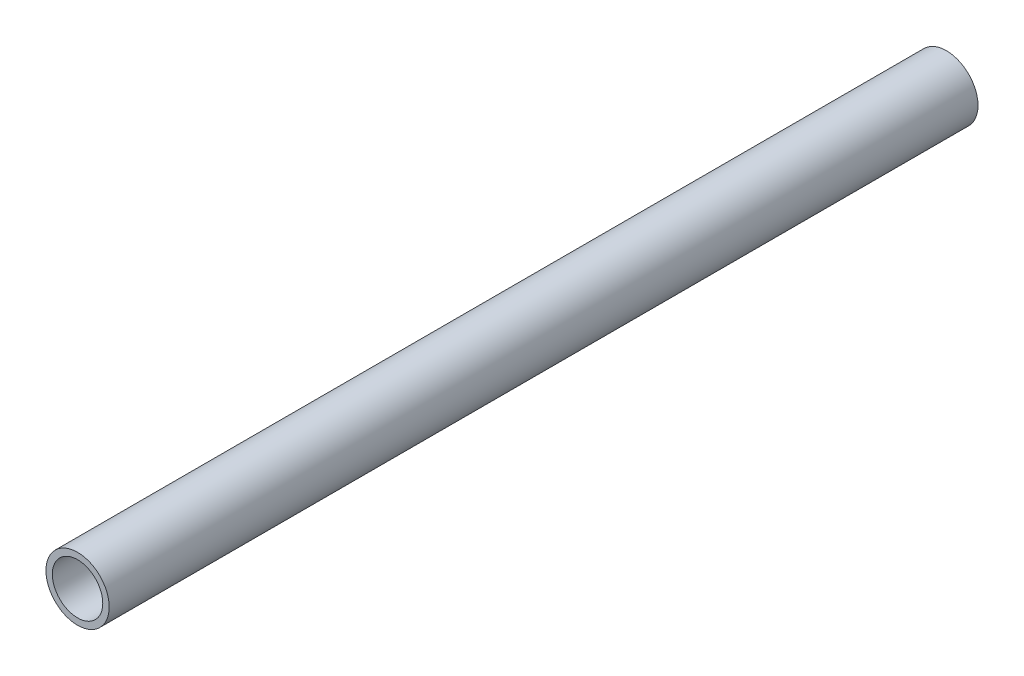
ISO-10303-21;
HEADER;
FILE_DESCRIPTION(('STEP AP214'),'2;1');
FILE_NAME('part.step','',(''),(''),'','','');
FILE_SCHEMA(('AUTOMOTIVE_DESIGN { 1 0 10303 214 1 1 1 1 }'));
ENDSEC;
DATA;
#1=APPLICATION_CONTEXT('core data for automotive mechanical design processes');
#2=APPLICATION_PROTOCOL_DEFINITION('international standard','automotive_design',2000,#1);
#3=PRODUCT_CONTEXT('',#1,'mechanical');
#4=PRODUCT('Part','Part','',(#3));
#5=PRODUCT_RELATED_PRODUCT_CATEGORY('part','',(#4));
#6=PRODUCT_DEFINITION_FORMATION('','',#4);
#7=PRODUCT_DEFINITION_CONTEXT('part definition',#1,'design');
#8=PRODUCT_DEFINITION('design','',#6,#7);
#9=PRODUCT_DEFINITION_SHAPE('','',#8);
#10=(LENGTH_UNIT() NAMED_UNIT(*) SI_UNIT(.MILLI.,.METRE.));
#11=(NAMED_UNIT(*) PLANE_ANGLE_UNIT() SI_UNIT($,.RADIAN.));
#12=(NAMED_UNIT(*) SI_UNIT($,.STERADIAN.) SOLID_ANGLE_UNIT());
#13=UNCERTAINTY_MEASURE_WITH_UNIT(LENGTH_MEASURE(1.E-05),#10,'distance_accuracy_value','');
#14=(GEOMETRIC_REPRESENTATION_CONTEXT(3) GLOBAL_UNCERTAINTY_ASSIGNED_CONTEXT((#13)) GLOBAL_UNIT_ASSIGNED_CONTEXT((#10,
#11,#12)) REPRESENTATION_CONTEXT('',''));
#15=CARTESIAN_POINT('',(0.,0.,0.));
#16=DIRECTION('',(0.,0.,1.));
#17=DIRECTION('',(1.,0.,0.));
#18=AXIS2_PLACEMENT_3D('',#15,#16,#17);
#19=CARTESIAN_POINT('',(0.,0.,229.5));
#20=DIRECTION('',(0.,0.,1.));
#21=DIRECTION('',(1.,0.,0.));
#22=AXIS2_PLACEMENT_3D('',#19,#20,#21);
#23=PLANE('',#22);
#24=CARTESIAN_POINT('',(0.,0.,229.5));
#25=DIRECTION('',(0.,0.,1.));
#26=DIRECTION('',(1.,0.,0.));
#27=AXIS2_PLACEMENT_3D('',#24,#25,#26);
#28=CIRCLE('',#27,16.7005);
#29=CARTESIAN_POINT('',(16.7005,0.,229.5));
#30=VERTEX_POINT('',#29);
#31=EDGE_CURVE('E10',#30,#30,#28,.T.);
#32=ORIENTED_EDGE('',*,*,#31,.T.);
#33=EDGE_LOOP('',(#32));
#34=FACE_BOUND('',#33,.T.);
#35=CARTESIAN_POINT('',(0.,0.,229.5));
#36=DIRECTION('',(0.,0.,1.));
#37=DIRECTION('',(1.,0.,0.));
#38=AXIS2_PLACEMENT_3D('',#35,#36,#37);
#39=CIRCLE('',#38,13.3223);
#40=CARTESIAN_POINT('',(13.3223,0.,229.5));
#41=VERTEX_POINT('',#40);
#42=EDGE_CURVE('E42',#41,#41,#39,.T.);
#43=ORIENTED_EDGE('',*,*,#42,.F.);
#44=EDGE_LOOP('',(#43));
#45=FACE_BOUND('',#44,.T.);
#46=ADVANCED_FACE('F31',(#34,#45),#23,.T.);
#47=CARTESIAN_POINT('',(0.,0.,-229.5));
#48=DIRECTION('',(0.,0.,1.));
#49=DIRECTION('',(1.,0.,0.));
#50=AXIS2_PLACEMENT_3D('',#47,#48,#49);
#51=PLANE('',#50);
#52=CARTESIAN_POINT('',(0.,0.,-229.5));
#53=DIRECTION('',(0.,0.,1.));
#54=DIRECTION('',(1.,0.,0.));
#55=AXIS2_PLACEMENT_3D('',#52,#53,#54);
#56=CIRCLE('',#55,16.7005);
#57=CARTESIAN_POINT('',(16.7005,0.,-229.5));
#58=VERTEX_POINT('',#57);
#59=EDGE_CURVE('E35',#58,#58,#56,.T.);
#60=ORIENTED_EDGE('',*,*,#59,.F.);
#61=EDGE_LOOP('',(#60));
#62=FACE_BOUND('',#61,.T.);
#63=CARTESIAN_POINT('',(0.,0.,-229.5));
#64=DIRECTION('',(0.,0.,1.));
#65=DIRECTION('',(1.,0.,0.));
#66=AXIS2_PLACEMENT_3D('',#63,#64,#65);
#67=CIRCLE('',#66,13.3223);
#68=CARTESIAN_POINT('',(13.3223,0.,-229.5));
#69=VERTEX_POINT('',#68);
#70=EDGE_CURVE('E44',#69,#69,#67,.T.);
#71=ORIENTED_EDGE('',*,*,#70,.T.);
#72=EDGE_LOOP('',(#71));
#73=FACE_BOUND('',#72,.T.);
#74=ADVANCED_FACE('F54',(#62,#73),#51,.F.);
#75=CARTESIAN_POINT('',(0.,0.,229.5));
#76=DIRECTION('',(0.,0.,-1.));
#77=DIRECTION('',(-1.,0.,0.));
#78=AXIS2_PLACEMENT_3D('',#75,#76,#77);
#79=CYLINDRICAL_SURFACE('',#78,16.7005);
#80=ORIENTED_EDGE('',*,*,#31,.F.);
#81=EDGE_LOOP('',(#80));
#82=FACE_BOUND('',#81,.T.);
#83=ORIENTED_EDGE('',*,*,#59,.T.);
#84=EDGE_LOOP('',(#83));
#85=FACE_BOUND('',#84,.T.);
#86=ADVANCED_FACE('F33',(#82,#85),#79,.T.);
#87=CARTESIAN_POINT('',(0.,0.,229.5));
#88=DIRECTION('',(0.,0.,-1.));
#89=DIRECTION('',(-1.,0.,0.));
#90=AXIS2_PLACEMENT_3D('',#87,#88,#89);
#91=CYLINDRICAL_SURFACE('',#90,13.3223);
#92=ORIENTED_EDGE('',*,*,#42,.T.);
#93=EDGE_LOOP('',(#92));
#94=FACE_BOUND('',#93,.T.);
#95=ORIENTED_EDGE('',*,*,#70,.F.);
#96=EDGE_LOOP('',(#95));
#97=FACE_BOUND('',#96,.T.);
#98=ADVANCED_FACE('F50',(#94,#97),#91,.F.);
#99=CLOSED_SHELL('',(#46,#74,#86,#98));
#100=MANIFOLD_SOLID_BREP('B2',#99);
#101=ADVANCED_BREP_SHAPE_REPRESENTATION('',(#18,#100),#14);
#102=SHAPE_DEFINITION_REPRESENTATION(#9,#101);
ENDSEC;
END-ISO-10303-21;
